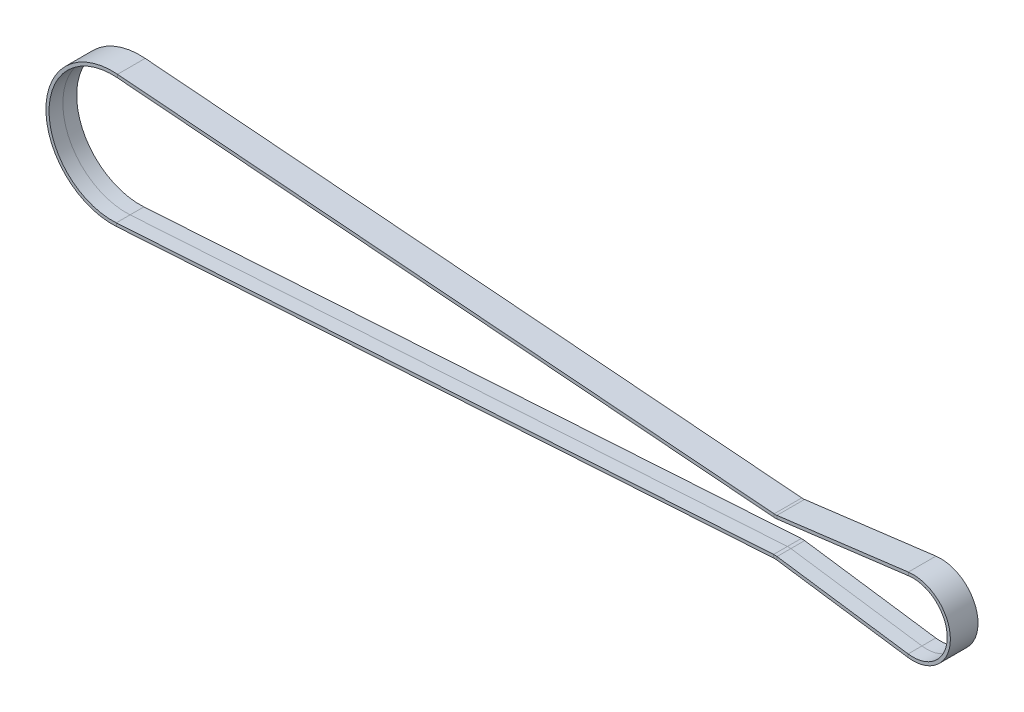
ISO-10303-21;
HEADER;
FILE_DESCRIPTION(('STEP AP214'),'2;1');
FILE_NAME('part.step','',(''),(''),'','','');
FILE_SCHEMA(('AUTOMOTIVE_DESIGN { 1 0 10303 214 1 1 1 1 }'));
ENDSEC;
DATA;
#1=APPLICATION_CONTEXT('core data for automotive mechanical design processes');
#2=APPLICATION_PROTOCOL_DEFINITION('international standard','automotive_design',2000,#1);
#3=PRODUCT_CONTEXT('',#1,'mechanical');
#4=PRODUCT('Part','Part','',(#3));
#5=PRODUCT_RELATED_PRODUCT_CATEGORY('part','',(#4));
#6=PRODUCT_DEFINITION_FORMATION('','',#4);
#7=PRODUCT_DEFINITION_CONTEXT('part definition',#1,'design');
#8=PRODUCT_DEFINITION('design','',#6,#7);
#9=PRODUCT_DEFINITION_SHAPE('','',#8);
#10=(LENGTH_UNIT() NAMED_UNIT(*) SI_UNIT(.MILLI.,.METRE.));
#11=(NAMED_UNIT(*) PLANE_ANGLE_UNIT() SI_UNIT($,.RADIAN.));
#12=(NAMED_UNIT(*) SI_UNIT($,.STERADIAN.) SOLID_ANGLE_UNIT());
#13=UNCERTAINTY_MEASURE_WITH_UNIT(LENGTH_MEASURE(1.E-05),#10,'distance_accuracy_value','');
#14=(GEOMETRIC_REPRESENTATION_CONTEXT(3) GLOBAL_UNCERTAINTY_ASSIGNED_CONTEXT((#13)) GLOBAL_UNIT_ASSIGNED_CONTEXT((#10,
#11,#12)) REPRESENTATION_CONTEXT('',''));
#15=CARTESIAN_POINT('',(0.,0.,0.));
#16=DIRECTION('',(0.,0.,1.));
#17=DIRECTION('',(1.,0.,0.));
#18=AXIS2_PLACEMENT_3D('',#15,#16,#17);
#19=CARTESIAN_POINT('',(-240.090138503193,-9.9164203972662,0.));
#20=DIRECTION('',(0.,0.,-1.));
#21=DIRECTION('',(-1.,0.,0.));
#22=AXIS2_PLACEMENT_3D('',#19,#20,#21);
#23=CYLINDRICAL_SURFACE('',#22,22.9);
#24=DIRECTION('',(0.,0.,1.));
#25=VECTOR('',#24,1.);
#26=CARTESIAN_POINT('',(-238.647292696642,-32.7709209601426,-5.));
#27=LINE('',#26,#25);
#28=CARTESIAN_POINT('',(-238.647292696642,-32.7709209601426,-5.));
#29=VERTEX_POINT('',#28);
#30=CARTESIAN_POINT('',(-238.647292696642,-32.7709209601426,0.));
#31=VERTEX_POINT('',#30);
#32=EDGE_CURVE('E242',#29,#31,#27,.T.);
#33=ORIENTED_EDGE('',*,*,#32,.F.);
#34=CARTESIAN_POINT('',(-240.090138503193,-9.9164203972662,-5.));
#35=DIRECTION('',(0.,0.,-1.));
#36=DIRECTION('',(0.063006367098305,-0.998013125016437,0.));
#37=AXIS2_PLACEMENT_3D('',#34,#35,#36);
#38=CIRCLE('',#37,22.9);
#39=CARTESIAN_POINT('',(-238.26979899704,12.9111148197111,-5.));
#40=VERTEX_POINT('',#39);
#41=EDGE_CURVE('E241',#29,#40,#38,.T.);
#42=ORIENTED_EDGE('',*,*,#41,.T.);
#43=DIRECTION('',(0.,0.,1.));
#44=VECTOR('',#43,1.);
#45=CARTESIAN_POINT('',(-238.26979899704,12.9111148197111,-5.));
#46=LINE('',#45,#44);
#47=CARTESIAN_POINT('',(-238.26979899704,12.9111148197111,0.));
#48=VERTEX_POINT('',#47);
#49=EDGE_CURVE('E216',#40,#48,#46,.T.);
#50=ORIENTED_EDGE('',*,*,#49,.T.);
#51=CARTESIAN_POINT('',(-240.090138503193,-9.9164203972662,0.));
#52=DIRECTION('',(0.,0.,-1.));
#53=DIRECTION('',(0.063006367098305,-0.998013125016437,0.));
#54=AXIS2_PLACEMENT_3D('',#51,#52,#53);
#55=CIRCLE('',#54,22.9);
#56=EDGE_CURVE('E246',#31,#48,#55,.T.);
#57=ORIENTED_EDGE('',*,*,#56,.F.);
#58=EDGE_LOOP('',(#33,#42,#50,#57));
#59=FACE_BOUND('',#58,.T.);
#60=ADVANCED_FACE('F32',(#59),#23,.F.);
#61=CARTESIAN_POINT('',(-238.26979899704,12.9111148197111,-5.));
#62=DIRECTION('',(0.0794908081289421,0.996835598994642,0.));
#63=DIRECTION('',(-0.996835598994642,0.0794908081289421,0.));
#64=AXIS2_PLACEMENT_3D('',#61,#62,#63);
#65=PLANE('',#64);
#66=DIRECTION('',(0.996835598994643,-0.0794908081289421,0.));
#67=VECTOR('',#66,1.);
#68=CARTESIAN_POINT('',(-238.26979899704,12.9111148197111,0.));
#69=LINE('',#68,#67);
#70=CARTESIAN_POINT('',(-0.482509205342596,-6.05079208589749,0.));
#71=VERTEX_POINT('',#70);
#72=EDGE_CURVE('E222',#48,#71,#69,.T.);
#73=ORIENTED_EDGE('',*,*,#72,.F.);
#74=ORIENTED_EDGE('',*,*,#49,.F.);
#75=DIRECTION('',(0.996835598994643,-0.0794908081289421,0.));
#76=VECTOR('',#75,1.);
#77=CARTESIAN_POINT('',(-238.26979899704,12.9111148197111,-5.));
#78=LINE('',#77,#76);
#79=CARTESIAN_POINT('',(-0.482509205342596,-6.05079208589749,-5.));
#80=VERTEX_POINT('',#79);
#81=EDGE_CURVE('E220',#40,#80,#78,.T.);
#82=ORIENTED_EDGE('',*,*,#81,.T.);
#83=DIRECTION('',(0.,0.,1.));
#84=VECTOR('',#83,1.);
#85=CARTESIAN_POINT('',(-0.482509205342624,-6.05079208589748,-5.));
#86=LINE('',#85,#84);
#87=EDGE_CURVE('E238',#80,#71,#86,.T.);
#88=ORIENTED_EDGE('',*,*,#87,.T.);
#89=EDGE_LOOP('',(#73,#74,#82,#88));
#90=FACE_BOUND('',#89,.T.);
#91=ADVANCED_FACE('F218',(#90),#65,.F.);
#92=CARTESIAN_POINT('',(-238.26979899704,12.9111148197111,0.));
#93=DIRECTION('',(0.0794908081289421,0.996835598994642,0.));
#94=DIRECTION('',(-0.996835598994642,0.0794908081289421,0.));
#95=AXIS2_PLACEMENT_3D('',#92,#93,#94);
#96=PLANE('',#95);
#97=DIRECTION('',(0.996835598994643,-0.0794908081289421,0.));
#98=VECTOR('',#97,1.);
#99=CARTESIAN_POINT('',(-238.26979899704,12.9111148197111,5.));
#100=LINE('',#99,#98);
#101=CARTESIAN_POINT('',(-238.26979899704,12.9111148197111,5.));
#102=VERTEX_POINT('',#101);
#103=CARTESIAN_POINT('',(-0.482509205342596,-6.05079208589749,5.));
#104=VERTEX_POINT('',#103);
#105=EDGE_CURVE('E357',#102,#104,#100,.T.);
#106=ORIENTED_EDGE('',*,*,#105,.F.);
#107=DIRECTION('',(0.,0.,1.));
#108=VECTOR('',#107,1.);
#109=CARTESIAN_POINT('',(-238.26979899704,12.9111148197111,0.));
#110=LINE('',#109,#108);
#111=EDGE_CURVE('E227',#48,#102,#110,.T.);
#112=ORIENTED_EDGE('',*,*,#111,.F.);
#113=ORIENTED_EDGE('',*,*,#72,.T.);
#114=DIRECTION('',(0.,0.,1.));
#115=VECTOR('',#114,1.);
#116=CARTESIAN_POINT('',(-0.482509205342624,-6.05079208589748,0.));
#117=LINE('',#116,#115);
#118=EDGE_CURVE('E431',#71,#104,#117,.T.);
#119=ORIENTED_EDGE('',*,*,#118,.T.);
#120=EDGE_LOOP('',(#106,#112,#113,#119));
#121=FACE_BOUND('',#120,.T.);
#122=ADVANCED_FACE('F503',(#121),#96,.F.);
#123=CARTESIAN_POINT('',(-238.26979899704,12.9111148197111,5.));
#124=DIRECTION('',(0.,0.,-1.));
#125=DIRECTION('',(-1.,0.,0.));
#126=AXIS2_PLACEMENT_3D('',#123,#124,#125);
#127=PLANE('',#126);
#128=DIRECTION('',(0.996835598994643,-0.0794908081289421,0.));
#129=VECTOR('',#128,1.);
#130=CARTESIAN_POINT('',(-238.179179475773,14.047507402565,5.));
#131=LINE('',#130,#129);
#132=CARTESIAN_POINT('',(-238.179179475773,14.047507402565,5.));
#133=VERTEX_POINT('',#132);
#134=CARTESIAN_POINT('',(-0.391889684075608,-4.91439950304359,5.));
#135=VERTEX_POINT('',#134);
#136=EDGE_CURVE('E299',#133,#135,#131,.T.);
#137=ORIENTED_EDGE('',*,*,#136,.F.);
#138=DIRECTION('',(0.0794908081289369,0.996835598994643,0.));
#139=VECTOR('',#138,1.);
#140=CARTESIAN_POINT('',(-238.26979899704,12.9111148197111,5.));
#141=LINE('',#140,#139);
#142=EDGE_CURVE('E252',#102,#133,#141,.T.);
#143=ORIENTED_EDGE('',*,*,#142,.F.);
#144=ORIENTED_EDGE('',*,*,#105,.T.);
#145=DIRECTION('',(0.0794908081289369,0.996835598994643,0.));
#146=VECTOR('',#145,1.);
#147=CARTESIAN_POINT('',(-0.482509205342624,-6.05079208589748,5.));
#148=LINE('',#147,#146);
#149=EDGE_CURVE('E355',#104,#135,#148,.T.);
#150=ORIENTED_EDGE('',*,*,#149,.T.);
#151=EDGE_LOOP('',(#137,#143,#144,#150));
#152=FACE_BOUND('',#151,.T.);
#153=ADVANCED_FACE('F510',(#152),#127,.F.);
#154=CARTESIAN_POINT('',(-238.179179475773,14.047507402565,5.));
#155=DIRECTION('',(-0.0794908081289421,-0.996835598994642,0.));
#156=DIRECTION('',(0.996835598994642,-0.0794908081289421,0.));
#157=AXIS2_PLACEMENT_3D('',#154,#155,#156);
#158=PLANE('',#157);
#159=DIRECTION('',(0.996835598994643,-0.0794908081289421,0.));
#160=VECTOR('',#159,1.);
#161=CARTESIAN_POINT('',(-238.179179475773,14.047507402565,-5.));
#162=LINE('',#161,#160);
#163=CARTESIAN_POINT('',(-238.179179475773,14.047507402565,-5.));
#164=VERTEX_POINT('',#163);
#165=CARTESIAN_POINT('',(-0.391889684075608,-4.91439950304359,-5.));
#166=VERTEX_POINT('',#165);
#167=EDGE_CURVE('E258',#164,#166,#162,.T.);
#168=ORIENTED_EDGE('',*,*,#167,.F.);
#169=DIRECTION('',(0.,0.,-1.));
#170=VECTOR('',#169,1.);
#171=CARTESIAN_POINT('',(-238.179179475773,14.047507402565,5.));
#172=LINE('',#171,#170);
#173=EDGE_CURVE('E249',#133,#164,#172,.T.);
#174=ORIENTED_EDGE('',*,*,#173,.F.);
#175=ORIENTED_EDGE('',*,*,#136,.T.);
#176=DIRECTION('',(0.,0.,-1.));
#177=VECTOR('',#176,1.);
#178=CARTESIAN_POINT('',(-0.391889684075636,-4.91439950304359,5.));
#179=LINE('',#178,#177);
#180=EDGE_CURVE('E302',#135,#166,#179,.T.);
#181=ORIENTED_EDGE('',*,*,#180,.T.);
#182=EDGE_LOOP('',(#168,#174,#175,#181));
#183=FACE_BOUND('',#182,.T.);
#184=ADVANCED_FACE('F297',(#183),#158,.F.);
#185=CARTESIAN_POINT('',(-238.179179475773,14.047507402565,-5.));
#186=DIRECTION('',(0.,0.,1.));
#187=DIRECTION('',(1.,0.,0.));
#188=AXIS2_PLACEMENT_3D('',#185,#186,#187);
#189=PLANE('',#188);
#190=DIRECTION('',(-0.0794908081289369,-0.996835598994643,0.));
#191=VECTOR('',#190,1.);
#192=CARTESIAN_POINT('',(-0.391889684075636,-4.91439950304359,-5.));
#193=LINE('',#192,#191);
#194=EDGE_CURVE('E236',#166,#80,#193,.T.);
#195=ORIENTED_EDGE('',*,*,#194,.T.);
#196=ORIENTED_EDGE('',*,*,#81,.F.);
#197=DIRECTION('',(-0.0794908081289369,-0.996835598994643,0.));
#198=VECTOR('',#197,1.);
#199=CARTESIAN_POINT('',(-238.179179475773,14.047507402565,-5.));
#200=LINE('',#199,#198);
#201=EDGE_CURVE('E234',#164,#40,#200,.T.);
#202=ORIENTED_EDGE('',*,*,#201,.F.);
#203=ORIENTED_EDGE('',*,*,#167,.T.);
#204=EDGE_LOOP('',(#195,#196,#202,#203));
#205=FACE_BOUND('',#204,.T.);
#206=ADVANCED_FACE('F232',(#205),#189,.F.);
#207=CARTESIAN_POINT('',(0.,0.,0.));
#208=DIRECTION('',(0.,0.,1.));
#209=DIRECTION('',(1.,0.,0.));
#210=AXIS2_PLACEMENT_3D('',#207,#208,#209);
#211=CYLINDRICAL_SURFACE('',#210,6.07000000000013);
#212=CARTESIAN_POINT('',(0.,0.,0.));
#213=DIRECTION('',(0.,0.,1.));
#214=DIRECTION('',(-0.0794908081289428,-0.996835598994642,0.));
#215=AXIS2_PLACEMENT_3D('',#212,#213,#214);
#216=CIRCLE('',#215,6.07000000000013);
#217=CARTESIAN_POINT('',(0.760799283202512,-6.02213288218387,0.));
#218=VERTEX_POINT('',#217);
#219=EDGE_CURVE('E438',#71,#218,#216,.T.);
#220=ORIENTED_EDGE('',*,*,#219,.F.);
#221=ORIENTED_EDGE('',*,*,#87,.F.);
#222=CARTESIAN_POINT('',(0.,0.,-5.));
#223=DIRECTION('',(0.,0.,1.));
#224=DIRECTION('',(-0.0794908081289428,-0.996835598994642,0.));
#225=AXIS2_PLACEMENT_3D('',#222,#223,#224);
#226=CIRCLE('',#225,6.07000000000013);
#227=CARTESIAN_POINT('',(0.760799283202512,-6.02213288218387,-5.));
#228=VERTEX_POINT('',#227);
#229=EDGE_CURVE('E257',#80,#228,#226,.T.);
#230=ORIENTED_EDGE('',*,*,#229,.T.);
#231=DIRECTION('',(0.,0.,1.));
#232=VECTOR('',#231,1.);
#233=CARTESIAN_POINT('',(0.760799283202496,-6.02213288218373,-5.));
#234=LINE('',#233,#232);
#235=EDGE_CURVE('E450',#228,#218,#234,.T.);
#236=ORIENTED_EDGE('',*,*,#235,.T.);
#237=EDGE_LOOP('',(#220,#221,#230,#236));
#238=FACE_BOUND('',#237,.T.);
#239=ADVANCED_FACE('F453',(#238),#211,.T.);
#240=CARTESIAN_POINT('',(0.,0.,0.));
#241=DIRECTION('',(0.,0.,1.));
#242=DIRECTION('',(1.,0.,0.));
#243=AXIS2_PLACEMENT_3D('',#240,#241,#242);
#244=CYLINDRICAL_SURFACE('',#243,6.07000000000013);
#245=CARTESIAN_POINT('',(0.,0.,5.));
#246=DIRECTION('',(0.,0.,1.));
#247=DIRECTION('',(-0.0794908081289428,-0.996835598994642,0.));
#248=AXIS2_PLACEMENT_3D('',#245,#246,#247);
#249=CIRCLE('',#248,6.07000000000013);
#250=CARTESIAN_POINT('',(0.760799283202512,-6.02213288218387,5.));
#251=VERTEX_POINT('',#250);
#252=EDGE_CURVE('E362',#104,#251,#249,.T.);
#253=ORIENTED_EDGE('',*,*,#252,.F.);
#254=ORIENTED_EDGE('',*,*,#118,.F.);
#255=ORIENTED_EDGE('',*,*,#219,.T.);
#256=DIRECTION('',(0.,0.,1.));
#257=VECTOR('',#256,1.);
#258=CARTESIAN_POINT('',(0.760799283202496,-6.02213288218373,0.));
#259=LINE('',#258,#257);
#260=EDGE_CURVE('E435',#218,#251,#259,.T.);
#261=ORIENTED_EDGE('',*,*,#260,.T.);
#262=EDGE_LOOP('',(#253,#254,#255,#261));
#263=FACE_BOUND('',#262,.T.);
#264=ADVANCED_FACE('F446',(#263),#244,.T.);
#265=CARTESIAN_POINT('',(-0.482509205342679,-6.05079208589761,5.));
#266=DIRECTION('',(0.,0.,-1.));
#267=DIRECTION('',(-1.,0.,0.));
#268=AXIS2_PLACEMENT_3D('',#265,#266,#267);
#269=PLANE('',#268);
#270=CARTESIAN_POINT('',(0.,0.,5.));
#271=DIRECTION('',(0.,0.,1.));
#272=DIRECTION('',(-0.0794908081289442,-0.996835598994642,0.));
#273=AXIS2_PLACEMENT_3D('',#270,#271,#272);
#274=CIRCLE('',#273,4.93000000000013);
#275=CARTESIAN_POINT('',(0.617914409586239,-4.89112275274574,5.));
#276=VERTEX_POINT('',#275);
#277=EDGE_CURVE('E310',#135,#276,#274,.T.);
#278=ORIENTED_EDGE('',*,*,#277,.F.);
#279=ORIENTED_EDGE('',*,*,#149,.F.);
#280=ORIENTED_EDGE('',*,*,#252,.T.);
#281=DIRECTION('',(-0.125337608435334,0.99211414862994,0.));
#282=VECTOR('',#281,1.);
#283=CARTESIAN_POINT('',(0.760799283202496,-6.02213288218373,5.));
#284=LINE('',#283,#282);
#285=EDGE_CURVE('E359',#251,#276,#284,.T.);
#286=ORIENTED_EDGE('',*,*,#285,.T.);
#287=EDGE_LOOP('',(#278,#279,#280,#286));
#288=FACE_BOUND('',#287,.T.);
#289=ADVANCED_FACE('F443',(#288),#269,.F.);
#290=CARTESIAN_POINT('',(0.,0.,0.));
#291=DIRECTION('',(0.,0.,1.));
#292=DIRECTION('',(1.,0.,0.));
#293=AXIS2_PLACEMENT_3D('',#290,#291,#292);
#294=CYLINDRICAL_SURFACE('',#293,4.93000000000013);
#295=CARTESIAN_POINT('',(0.,0.,-5.));
#296=DIRECTION('',(0.,0.,1.));
#297=DIRECTION('',(-0.0794908081289442,-0.996835598994642,0.));
#298=AXIS2_PLACEMENT_3D('',#295,#296,#297);
#299=CIRCLE('',#298,4.93000000000013);
#300=CARTESIAN_POINT('',(0.617914409586239,-4.89112275274574,-5.));
#301=VERTEX_POINT('',#300);
#302=EDGE_CURVE('E263',#166,#301,#299,.T.);
#303=ORIENTED_EDGE('',*,*,#302,.F.);
#304=ORIENTED_EDGE('',*,*,#180,.F.);
#305=ORIENTED_EDGE('',*,*,#277,.T.);
#306=DIRECTION('',(0.,0.,-1.));
#307=VECTOR('',#306,1.);
#308=CARTESIAN_POINT('',(0.617914409586223,-4.89112275274561,5.));
#309=LINE('',#308,#307);
#310=EDGE_CURVE('E307',#276,#301,#309,.T.);
#311=ORIENTED_EDGE('',*,*,#310,.T.);
#312=EDGE_LOOP('',(#303,#304,#305,#311));
#313=FACE_BOUND('',#312,.T.);
#314=ADVANCED_FACE('F571',(#313),#294,.F.);
#315=CARTESIAN_POINT('',(-0.391889684075691,-4.91439950304372,-5.));
#316=DIRECTION('',(0.,0.,1.));
#317=DIRECTION('',(1.,0.,0.));
#318=AXIS2_PLACEMENT_3D('',#315,#316,#317);
#319=PLANE('',#318);
#320=DIRECTION('',(0.125337608435334,-0.99211414862994,0.));
#321=VECTOR('',#320,1.);
#322=CARTESIAN_POINT('',(0.617914409586223,-4.89112275274561,-5.));
#323=LINE('',#322,#321);
#324=EDGE_CURVE('E259',#301,#228,#323,.T.);
#325=ORIENTED_EDGE('',*,*,#324,.T.);
#326=ORIENTED_EDGE('',*,*,#229,.F.);
#327=ORIENTED_EDGE('',*,*,#194,.F.);
#328=ORIENTED_EDGE('',*,*,#302,.T.);
#329=EDGE_LOOP('',(#325,#326,#327,#328));
#330=FACE_BOUND('',#329,.T.);
#331=ADVANCED_FACE('F569',(#330),#319,.F.);
#332=CARTESIAN_POINT('',(0.760799283202496,-6.02213288218374,-5.));
#333=DIRECTION('',(-0.125337608435329,0.992114148629941,0.));
#334=DIRECTION('',(-0.992114148629941,-0.125337608435329,0.));
#335=AXIS2_PLACEMENT_3D('',#332,#333,#334);
#336=PLANE('',#335);
#337=DIRECTION('',(0.992114148629941,0.125337608435329,0.));
#338=VECTOR('',#337,1.);
#339=CARTESIAN_POINT('',(0.760799283202496,-6.02213288218374,0.));
#340=LINE('',#339,#338);
#341=CARTESIAN_POINT('',(48.3457742612661,-0.0105393881873993,0.));
#342=VERTEX_POINT('',#341);
#343=EDGE_CURVE('E404',#218,#342,#340,.T.);
#344=ORIENTED_EDGE('',*,*,#343,.F.);
#345=ORIENTED_EDGE('',*,*,#235,.F.);
#346=DIRECTION('',(0.992114148629941,0.125337608435329,0.));
#347=VECTOR('',#346,1.);
#348=CARTESIAN_POINT('',(0.760799283202496,-6.02213288218374,-5.));
#349=LINE('',#348,#347);
#350=CARTESIAN_POINT('',(48.3457742612661,-0.0105393881873993,-5.));
#351=VERTEX_POINT('',#350);
#352=EDGE_CURVE('E262',#228,#351,#349,.T.);
#353=ORIENTED_EDGE('',*,*,#352,.T.);
#354=DIRECTION('',(0.,0.,1.));
#355=VECTOR('',#354,1.);
#356=CARTESIAN_POINT('',(48.3457742612661,-0.0105393881873958,-5.));
#357=LINE('',#356,#355);
#358=EDGE_CURVE('E458',#351,#342,#357,.T.);
#359=ORIENTED_EDGE('',*,*,#358,.T.);
#360=EDGE_LOOP('',(#344,#345,#353,#359));
#361=FACE_BOUND('',#360,.T.);
#362=ADVANCED_FACE('F456',(#361),#336,.F.);
#363=CARTESIAN_POINT('',(0.760799283202496,-6.02213288218374,0.));
#364=DIRECTION('',(-0.125337608435329,0.992114148629941,0.));
#365=DIRECTION('',(-0.992114148629941,-0.125337608435329,0.));
#366=AXIS2_PLACEMENT_3D('',#363,#364,#365);
#367=PLANE('',#366);
#368=DIRECTION('',(0.992114148629941,0.125337608435329,0.));
#369=VECTOR('',#368,1.);
#370=CARTESIAN_POINT('',(0.760799283202496,-6.02213288218374,5.));
#371=LINE('',#370,#369);
#372=CARTESIAN_POINT('',(48.3457742612661,-0.0105393881873993,5.));
#373=VERTEX_POINT('',#372);
#374=EDGE_CURVE('E367',#251,#373,#371,.T.);
#375=ORIENTED_EDGE('',*,*,#374,.F.);
#376=ORIENTED_EDGE('',*,*,#260,.F.);
#377=ORIENTED_EDGE('',*,*,#343,.T.);
#378=DIRECTION('',(0.,0.,1.));
#379=VECTOR('',#378,1.);
#380=CARTESIAN_POINT('',(48.3457742612661,-0.0105393881873958,0.));
#381=LINE('',#380,#379);
#382=EDGE_CURVE('E400',#342,#373,#381,.T.);
#383=ORIENTED_EDGE('',*,*,#382,.T.);
#384=EDGE_LOOP('',(#375,#376,#377,#383));
#385=FACE_BOUND('',#384,.T.);
#386=ADVANCED_FACE('F402',(#385),#367,.F.);
#387=CARTESIAN_POINT('',(0.760799283202496,-6.02213288218374,5.));
#388=DIRECTION('',(0.,0.,-1.));
#389=DIRECTION('',(-1.,0.,0.));
#390=AXIS2_PLACEMENT_3D('',#387,#388,#389);
#391=PLANE('',#390);
#392=DIRECTION('',(0.992114148629941,0.125337608435329,0.));
#393=VECTOR('',#392,1.);
#394=CARTESIAN_POINT('',(0.617914409586223,-4.89112275274562,5.));
#395=LINE('',#394,#393);
#396=CARTESIAN_POINT('',(48.2028893876498,1.12047074125072,5.));
#397=VERTEX_POINT('',#396);
#398=EDGE_CURVE('E315',#276,#397,#395,.T.);
#399=ORIENTED_EDGE('',*,*,#398,.F.);
#400=ORIENTED_EDGE('',*,*,#285,.F.);
#401=ORIENTED_EDGE('',*,*,#374,.T.);
#402=DIRECTION('',(-0.125337608435334,0.99211414862994,0.));
#403=VECTOR('',#402,1.);
#404=CARTESIAN_POINT('',(48.3457742612661,-0.0105393881873958,5.));
#405=LINE('',#404,#403);
#406=EDGE_CURVE('E364',#373,#397,#405,.T.);
#407=ORIENTED_EDGE('',*,*,#406,.T.);
#408=EDGE_LOOP('',(#399,#400,#401,#407));
#409=FACE_BOUND('',#408,.T.);
#410=ADVANCED_FACE('F395',(#409),#391,.F.);
#411=CARTESIAN_POINT('',(0.617914409586223,-4.89112275274562,5.));
#412=DIRECTION('',(0.125337608435329,-0.992114148629941,0.));
#413=DIRECTION('',(0.992114148629941,0.125337608435329,0.));
#414=AXIS2_PLACEMENT_3D('',#411,#412,#413);
#415=PLANE('',#414);
#416=DIRECTION('',(0.992114148629941,0.125337608435329,0.));
#417=VECTOR('',#416,1.);
#418=CARTESIAN_POINT('',(0.617914409586223,-4.89112275274562,-5.));
#419=LINE('',#418,#417);
#420=CARTESIAN_POINT('',(48.2028893876498,1.12047074125072,-5.));
#421=VERTEX_POINT('',#420);
#422=EDGE_CURVE('E268',#301,#421,#419,.T.);
#423=ORIENTED_EDGE('',*,*,#422,.F.);
#424=ORIENTED_EDGE('',*,*,#310,.F.);
#425=ORIENTED_EDGE('',*,*,#398,.T.);
#426=DIRECTION('',(0.,0.,-1.));
#427=VECTOR('',#426,1.);
#428=CARTESIAN_POINT('',(48.2028893876498,1.12047074125073,5.));
#429=LINE('',#428,#427);
#430=EDGE_CURVE('E312',#397,#421,#429,.T.);
#431=ORIENTED_EDGE('',*,*,#430,.T.);
#432=EDGE_LOOP('',(#423,#424,#425,#431));
#433=FACE_BOUND('',#432,.T.);
#434=ADVANCED_FACE('F391',(#433),#415,.F.);
#435=CARTESIAN_POINT('',(0.617914409586223,-4.89112275274562,-5.));
#436=DIRECTION('',(0.,0.,1.));
#437=DIRECTION('',(1.,0.,0.));
#438=AXIS2_PLACEMENT_3D('',#435,#436,#437);
#439=PLANE('',#438);
#440=DIRECTION('',(0.125337608435334,-0.99211414862994,0.));
#441=VECTOR('',#440,1.);
#442=CARTESIAN_POINT('',(48.2028893876498,1.12047074125073,-5.));
#443=LINE('',#442,#441);
#444=EDGE_CURVE('E264',#421,#351,#443,.T.);
#445=ORIENTED_EDGE('',*,*,#444,.T.);
#446=ORIENTED_EDGE('',*,*,#352,.F.);
#447=ORIENTED_EDGE('',*,*,#324,.F.);
#448=ORIENTED_EDGE('',*,*,#422,.T.);
#449=EDGE_LOOP('',(#445,#446,#447,#448));
#450=FACE_BOUND('',#449,.T.);
#451=ADVANCED_FACE('F386',(#450),#439,.F.);
#452=CARTESIAN_POINT('',(49.8999606058641,-12.3127548311987,0.));
#453=DIRECTION('',(0.,0.,-1.));
#454=DIRECTION('',(-1.,0.,0.));
#455=AXIS2_PLACEMENT_3D('',#452,#453,#454);
#456=CYLINDRICAL_SURFACE('',#455,12.4);
#457=CARTESIAN_POINT('',(49.8999606058641,-12.3127548311987,0.));
#458=DIRECTION('',(0.,0.,-1.));
#459=DIRECTION('',(-0.125337608435331,0.992114148629941,0.));
#460=AXIS2_PLACEMENT_3D('',#457,#458,#459);
#461=CIRCLE('',#460,12.4);
#462=CARTESIAN_POINT('',(48.1426815657474,-24.5876059657406,0.));
#463=VERTEX_POINT('',#462);
#464=EDGE_CURVE('E193',#342,#463,#461,.T.);
#465=ORIENTED_EDGE('',*,*,#464,.F.);
#466=ORIENTED_EDGE('',*,*,#358,.F.);
#467=CARTESIAN_POINT('',(49.8999606058641,-12.3127548311987,-5.));
#468=DIRECTION('',(0.,0.,-1.));
#469=DIRECTION('',(-0.125337608435331,0.992114148629941,0.));
#470=AXIS2_PLACEMENT_3D('',#467,#468,#469);
#471=CIRCLE('',#470,12.4);
#472=CARTESIAN_POINT('',(48.1426815657474,-24.5876059657406,-5.));
#473=VERTEX_POINT('',#472);
#474=EDGE_CURVE('E267',#351,#473,#471,.T.);
#475=ORIENTED_EDGE('',*,*,#474,.T.);
#476=DIRECTION('',(0.,0.,1.));
#477=VECTOR('',#476,1.);
#478=CARTESIAN_POINT('',(48.1426815657474,-24.5876059657406,-5.));
#479=LINE('',#478,#477);
#480=EDGE_CURVE('E464',#473,#463,#479,.T.);
#481=ORIENTED_EDGE('',*,*,#480,.T.);
#482=EDGE_LOOP('',(#465,#466,#475,#481));
#483=FACE_BOUND('',#482,.T.);
#484=ADVANCED_FACE('F516',(#483),#456,.F.);
#485=CARTESIAN_POINT('',(49.8999606058641,-12.3127548311987,0.));
#486=DIRECTION('',(0.,0.,-1.));
#487=DIRECTION('',(-1.,0.,0.));
#488=AXIS2_PLACEMENT_3D('',#485,#486,#487);
#489=CYLINDRICAL_SURFACE('',#488,12.4);
#490=CARTESIAN_POINT('',(49.8999606058641,-12.3127548311987,5.));
#491=DIRECTION('',(0.,0.,-1.));
#492=DIRECTION('',(-0.125337608435331,0.992114148629941,0.));
#493=AXIS2_PLACEMENT_3D('',#490,#491,#492);
#494=CIRCLE('',#493,12.4);
#495=CARTESIAN_POINT('',(48.1426815657474,-24.5876059657406,5.));
#496=VERTEX_POINT('',#495);
#497=EDGE_CURVE('E187',#373,#496,#494,.T.);
#498=ORIENTED_EDGE('',*,*,#497,.F.);
#499=ORIENTED_EDGE('',*,*,#382,.F.);
#500=ORIENTED_EDGE('',*,*,#464,.T.);
#501=DIRECTION('',(0.,0.,1.));
#502=VECTOR('',#501,1.);
#503=CARTESIAN_POINT('',(48.1426815657474,-24.5876059657406,0.));
#504=LINE('',#503,#502);
#505=EDGE_CURVE('E408',#463,#496,#504,.T.);
#506=ORIENTED_EDGE('',*,*,#505,.T.);
#507=EDGE_LOOP('',(#498,#499,#500,#506));
#508=FACE_BOUND('',#507,.T.);
#509=ADVANCED_FACE('F407',(#508),#489,.F.);
#510=CARTESIAN_POINT('',(48.345774261266,-0.0105393881873958,5.));
#511=DIRECTION('',(0.,0.,-1.));
#512=DIRECTION('',(-1.,0.,0.));
#513=AXIS2_PLACEMENT_3D('',#510,#511,#512);
#514=PLANE('',#513);
#515=CARTESIAN_POINT('',(49.8999606058641,-12.3127548311987,5.));
#516=DIRECTION('',(0.,0.,-1.));
#517=DIRECTION('',(-0.125337608435328,0.992114148629941,0.));
#518=AXIS2_PLACEMENT_3D('',#515,#516,#517);
#519=CIRCLE('',#518,13.54);
#520=CARTESIAN_POINT('',(47.9811252668979,-25.7161003442388,5.));
#521=VERTEX_POINT('',#520);
#522=EDGE_CURVE('E320',#397,#521,#519,.T.);
#523=ORIENTED_EDGE('',*,*,#522,.F.);
#524=ORIENTED_EDGE('',*,*,#406,.F.);
#525=ORIENTED_EDGE('',*,*,#497,.T.);
#526=DIRECTION('',(-0.141716051622315,-0.989907349559837,0.));
#527=VECTOR('',#526,1.);
#528=CARTESIAN_POINT('',(48.1426815657474,-24.5876059657406,5.));
#529=LINE('',#528,#527);
#530=EDGE_CURVE('E369',#496,#521,#529,.T.);
#531=ORIENTED_EDGE('',*,*,#530,.T.);
#532=EDGE_LOOP('',(#523,#524,#525,#531));
#533=FACE_BOUND('',#532,.T.);
#534=ADVANCED_FACE('F375',(#533),#514,.F.);
#535=CARTESIAN_POINT('',(49.8999606058641,-12.3127548311987,0.));
#536=DIRECTION('',(0.,0.,-1.));
#537=DIRECTION('',(-1.,0.,0.));
#538=AXIS2_PLACEMENT_3D('',#535,#536,#537);
#539=CYLINDRICAL_SURFACE('',#538,13.54);
#540=CARTESIAN_POINT('',(49.8999606058641,-12.3127548311987,-5.));
#541=DIRECTION('',(0.,0.,-1.));
#542=DIRECTION('',(-0.125337608435328,0.992114148629941,0.));
#543=AXIS2_PLACEMENT_3D('',#540,#541,#542);
#544=CIRCLE('',#543,13.54);
#545=CARTESIAN_POINT('',(47.9811252668979,-25.7161003442388,-5.));
#546=VERTEX_POINT('',#545);
#547=EDGE_CURVE('E273',#421,#546,#544,.T.);
#548=ORIENTED_EDGE('',*,*,#547,.F.);
#549=ORIENTED_EDGE('',*,*,#430,.F.);
#550=ORIENTED_EDGE('',*,*,#522,.T.);
#551=DIRECTION('',(0.,0.,-1.));
#552=VECTOR('',#551,1.);
#553=CARTESIAN_POINT('',(47.9811252668979,-25.7161003442388,5.));
#554=LINE('',#553,#552);
#555=EDGE_CURVE('E317',#521,#546,#554,.T.);
#556=ORIENTED_EDGE('',*,*,#555,.T.);
#557=EDGE_LOOP('',(#548,#549,#550,#556));
#558=FACE_BOUND('',#557,.T.);
#559=ADVANCED_FACE('F374',(#558),#539,.T.);
#560=CARTESIAN_POINT('',(48.2028893876498,1.12047074125073,-5.));
#561=DIRECTION('',(0.,0.,1.));
#562=DIRECTION('',(1.,0.,0.));
#563=AXIS2_PLACEMENT_3D('',#560,#561,#562);
#564=PLANE('',#563);
#565=DIRECTION('',(0.141716051622315,0.989907349559837,0.));
#566=VECTOR('',#565,1.);
#567=CARTESIAN_POINT('',(47.9811252668979,-25.7161003442388,-5.));
#568=LINE('',#567,#566);
#569=EDGE_CURVE('E269',#546,#473,#568,.T.);
#570=ORIENTED_EDGE('',*,*,#569,.T.);
#571=ORIENTED_EDGE('',*,*,#474,.F.);
#572=ORIENTED_EDGE('',*,*,#444,.F.);
#573=ORIENTED_EDGE('',*,*,#547,.T.);
#574=EDGE_LOOP('',(#570,#571,#572,#573));
#575=FACE_BOUND('',#574,.T.);
#576=ADVANCED_FACE('F382',(#575),#564,.F.);
#577=CARTESIAN_POINT('',(48.1426815657474,-24.5876059657406,-5.));
#578=DIRECTION('',(-0.14171605162232,-0.989907349559836,0.));
#579=DIRECTION('',(0.989907349559836,-0.14171605162232,0.));
#580=AXIS2_PLACEMENT_3D('',#577,#578,#579);
#581=PLANE('',#580);
#582=DIRECTION('',(-0.989907349559836,0.14171605162232,0.));
#583=VECTOR('',#582,1.);
#584=CARTESIAN_POINT('',(48.1426815657474,-24.5876059657406,0.));
#585=LINE('',#584,#583);
#586=CARTESIAN_POINT('',(0.663551745398186,-17.7904498322951,0.));
#587=VERTEX_POINT('',#586);
#588=EDGE_CURVE('E160',#463,#587,#585,.T.);
#589=ORIENTED_EDGE('',*,*,#588,.F.);
#590=ORIENTED_EDGE('',*,*,#480,.F.);
#591=DIRECTION('',(-0.989907349559836,0.14171605162232,0.));
#592=VECTOR('',#591,1.);
#593=CARTESIAN_POINT('',(48.1426815657474,-24.5876059657406,-5.));
#594=LINE('',#593,#592);
#595=CARTESIAN_POINT('',(0.663551745398186,-17.7904498322951,-5.));
#596=VERTEX_POINT('',#595);
#597=EDGE_CURVE('E272',#473,#596,#594,.T.);
#598=ORIENTED_EDGE('',*,*,#597,.T.);
#599=DIRECTION('',(0.,0.,1.));
#600=VECTOR('',#599,1.);
#601=CARTESIAN_POINT('',(0.6635517453982,-17.7904498322951,-5.));
#602=LINE('',#601,#600);
#603=EDGE_CURVE('E324',#596,#587,#602,.T.);
#604=ORIENTED_EDGE('',*,*,#603,.T.);
#605=EDGE_LOOP('',(#589,#590,#598,#604));
#606=FACE_BOUND('',#605,.T.);
#607=ADVANCED_FACE('F487',(#606),#581,.F.);
#608=CARTESIAN_POINT('',(48.1426815657474,-24.5876059657406,0.));
#609=DIRECTION('',(-0.14171605162232,-0.989907349559836,0.));
#610=DIRECTION('',(0.989907349559836,-0.14171605162232,0.));
#611=AXIS2_PLACEMENT_3D('',#608,#609,#610);
#612=PLANE('',#611);
#613=DIRECTION('',(-0.989907349559836,0.14171605162232,0.));
#614=VECTOR('',#613,1.);
#615=CARTESIAN_POINT('',(48.1426815657474,-24.5876059657406,5.));
#616=LINE('',#615,#614);
#617=CARTESIAN_POINT('',(0.663551745398186,-17.7904498322951,5.));
#618=VERTEX_POINT('',#617);
#619=EDGE_CURVE('E153',#496,#618,#616,.T.);
#620=ORIENTED_EDGE('',*,*,#619,.F.);
#621=ORIENTED_EDGE('',*,*,#505,.F.);
#622=ORIENTED_EDGE('',*,*,#588,.T.);
#623=DIRECTION('',(0.,0.,1.));
#624=VECTOR('',#623,1.);
#625=CARTESIAN_POINT('',(0.6635517453982,-17.7904498322951,0.));
#626=LINE('',#625,#624);
#627=EDGE_CURVE('E328',#587,#618,#626,.T.);
#628=ORIENTED_EDGE('',*,*,#627,.T.);
#629=EDGE_LOOP('',(#620,#621,#622,#628));
#630=FACE_BOUND('',#629,.T.);
#631=ADVANCED_FACE('F485',(#630),#612,.F.);
#632=CARTESIAN_POINT('',(48.1426815657474,-24.5876059657406,5.));
#633=DIRECTION('',(0.,0.,-1.));
#634=DIRECTION('',(-1.,0.,0.));
#635=AXIS2_PLACEMENT_3D('',#632,#633,#634);
#636=PLANE('',#635);
#637=DIRECTION('',(-0.989907349559836,0.14171605162232,0.));
#638=VECTOR('',#637,1.);
#639=CARTESIAN_POINT('',(47.9811252668979,-25.7161003442388,5.));
#640=LINE('',#639,#638);
#641=CARTESIAN_POINT('',(0.501995446548734,-18.9189442107933,5.));
#642=VERTEX_POINT('',#641);
#643=EDGE_CURVE('E146',#521,#642,#640,.T.);
#644=ORIENTED_EDGE('',*,*,#643,.F.);
#645=ORIENTED_EDGE('',*,*,#530,.F.);
#646=ORIENTED_EDGE('',*,*,#619,.T.);
#647=DIRECTION('',(-0.141716051622315,-0.989907349559837,0.));
#648=VECTOR('',#647,1.);
#649=CARTESIAN_POINT('',(0.6635517453982,-17.7904498322951,5.));
#650=LINE('',#649,#648);
#651=EDGE_CURVE('E322',#618,#642,#650,.T.);
#652=ORIENTED_EDGE('',*,*,#651,.T.);
#653=EDGE_LOOP('',(#644,#645,#646,#652));
#654=FACE_BOUND('',#653,.T.);
#655=ADVANCED_FACE('F376',(#654),#636,.F.);
#656=CARTESIAN_POINT('',(47.9811252668979,-25.7161003442388,5.));
#657=DIRECTION('',(0.14171605162232,0.989907349559836,0.));
#658=DIRECTION('',(-0.989907349559836,0.14171605162232,0.));
#659=AXIS2_PLACEMENT_3D('',#656,#657,#658);
#660=PLANE('',#659);
#661=DIRECTION('',(-0.989907349559836,0.14171605162232,0.));
#662=VECTOR('',#661,1.);
#663=CARTESIAN_POINT('',(47.9811252668979,-25.7161003442388,-5.));
#664=LINE('',#663,#662);
#665=CARTESIAN_POINT('',(0.501995446548734,-18.9189442107933,-5.));
#666=VERTEX_POINT('',#665);
#667=EDGE_CURVE('E323',#546,#666,#664,.T.);
#668=ORIENTED_EDGE('',*,*,#667,.F.);
#669=ORIENTED_EDGE('',*,*,#555,.F.);
#670=ORIENTED_EDGE('',*,*,#643,.T.);
#671=DIRECTION('',(0.,0.,-1.));
#672=VECTOR('',#671,1.);
#673=CARTESIAN_POINT('',(0.501995446548748,-18.9189442107933,5.));
#674=LINE('',#673,#672);
#675=EDGE_CURVE('E277',#642,#666,#674,.T.);
#676=ORIENTED_EDGE('',*,*,#675,.T.);
#677=EDGE_LOOP('',(#668,#669,#670,#676));
#678=FACE_BOUND('',#677,.T.);
#679=ADVANCED_FACE('F377',(#678),#660,.F.);
#680=CARTESIAN_POINT('',(47.9811252668979,-25.7161003442388,-5.));
#681=DIRECTION('',(0.,0.,1.));
#682=DIRECTION('',(1.,0.,0.));
#683=AXIS2_PLACEMENT_3D('',#680,#681,#682);
#684=PLANE('',#683);
#685=DIRECTION('',(0.141716051622315,0.989907349559837,0.));
#686=VECTOR('',#685,1.);
#687=CARTESIAN_POINT('',(0.501995446548748,-18.9189442107933,-5.));
#688=LINE('',#687,#686);
#689=EDGE_CURVE('E274',#666,#596,#688,.T.);
#690=ORIENTED_EDGE('',*,*,#689,.T.);
#691=ORIENTED_EDGE('',*,*,#597,.F.);
#692=ORIENTED_EDGE('',*,*,#569,.F.);
#693=ORIENTED_EDGE('',*,*,#667,.T.);
#694=EDGE_LOOP('',(#690,#691,#692,#693));
#695=FACE_BOUND('',#694,.T.);
#696=ADVANCED_FACE('F379',(#695),#684,.F.);
#697=CARTESIAN_POINT('',(-0.19666468794928,-23.7991874441233,0.));
#698=DIRECTION('',(0.,0.,1.));
#699=DIRECTION('',(1.,0.,0.));
#700=AXIS2_PLACEMENT_3D('',#697,#698,#699);
#701=CYLINDRICAL_SURFACE('',#700,6.07);
#702=CARTESIAN_POINT('',(-0.19666468794928,-23.7991874441233,0.));
#703=DIRECTION('',(0.,0.,1.));
#704=DIRECTION('',(0.14171605162232,0.989907349559836,0.));
#705=AXIS2_PLACEMENT_3D('',#702,#703,#704);
#706=CIRCLE('',#705,6.07);
#707=CARTESIAN_POINT('',(-0.579113336236003,-17.7412477752735,0.));
#708=VERTEX_POINT('',#707);
#709=EDGE_CURVE('E415',#587,#708,#706,.T.);
#710=ORIENTED_EDGE('',*,*,#709,.F.);
#711=ORIENTED_EDGE('',*,*,#603,.F.);
#712=CARTESIAN_POINT('',(-0.19666468794928,-23.7991874441233,-5.));
#713=DIRECTION('',(0.,0.,1.));
#714=DIRECTION('',(0.14171605162232,0.989907349559836,0.));
#715=AXIS2_PLACEMENT_3D('',#712,#713,#714);
#716=CIRCLE('',#715,6.07);
#717=CARTESIAN_POINT('',(-0.579113336236003,-17.7412477752735,-5.));
#718=VERTEX_POINT('',#717);
#719=EDGE_CURVE('E276',#596,#718,#716,.T.);
#720=ORIENTED_EDGE('',*,*,#719,.T.);
#721=DIRECTION('',(0.,0.,1.));
#722=VECTOR('',#721,1.);
#723=CARTESIAN_POINT('',(-0.579113336236003,-17.7412477752735,-5.));
#724=LINE('',#723,#722);
#725=EDGE_CURVE('E470',#718,#708,#724,.T.);
#726=ORIENTED_EDGE('',*,*,#725,.T.);
#727=EDGE_LOOP('',(#710,#711,#720,#726));
#728=FACE_BOUND('',#727,.T.);
#729=ADVANCED_FACE('F477',(#728),#701,.T.);
#730=CARTESIAN_POINT('',(-0.19666468794928,-23.7991874441233,0.));
#731=DIRECTION('',(0.,0.,1.));
#732=DIRECTION('',(1.,0.,0.));
#733=AXIS2_PLACEMENT_3D('',#730,#731,#732);
#734=CYLINDRICAL_SURFACE('',#733,6.07);
#735=CARTESIAN_POINT('',(-0.19666468794928,-23.7991874441233,5.));
#736=DIRECTION('',(0.,0.,1.));
#737=DIRECTION('',(0.14171605162232,0.989907349559836,0.));
#738=AXIS2_PLACEMENT_3D('',#735,#736,#737);
#739=CIRCLE('',#738,6.07);
#740=CARTESIAN_POINT('',(-0.579113336236003,-17.7412477752735,5.));
#741=VERTEX_POINT('',#740);
#742=EDGE_CURVE('E119',#618,#741,#739,.T.);
#743=ORIENTED_EDGE('',*,*,#742,.F.);
#744=ORIENTED_EDGE('',*,*,#627,.F.);
#745=ORIENTED_EDGE('',*,*,#709,.T.);
#746=DIRECTION('',(0.,0.,1.));
#747=VECTOR('',#746,1.);
#748=CARTESIAN_POINT('',(-0.579113336236003,-17.7412477752735,0.));
#749=LINE('',#748,#747);
#750=EDGE_CURVE('E413',#708,#741,#749,.T.);
#751=ORIENTED_EDGE('',*,*,#750,.T.);
#752=EDGE_LOOP('',(#743,#744,#745,#751));
#753=FACE_BOUND('',#752,.T.);
#754=ADVANCED_FACE('F483',(#753),#734,.T.);
#755=CARTESIAN_POINT('',(0.6635517453982,-17.7904498322951,5.));
#756=DIRECTION('',(0.,0.,-1.));
#757=DIRECTION('',(-1.,0.,0.));
#758=AXIS2_PLACEMENT_3D('',#755,#756,#757);
#759=PLANE('',#758);
#760=CARTESIAN_POINT('',(-0.19666468794928,-23.7991874441233,5.));
#761=DIRECTION('',(0.,0.,1.));
#762=DIRECTION('',(0.141716051622318,0.989907349559837,0.));
#763=AXIS2_PLACEMENT_3D('',#760,#761,#762);
#764=CIRCLE('',#763,4.93);
#765=CARTESIAN_POINT('',(-0.507286077743945,-18.8789827377923,5.));
#766=VERTEX_POINT('',#765);
#767=EDGE_CURVE('E111',#642,#766,#764,.T.);
#768=ORIENTED_EDGE('',*,*,#767,.F.);
#769=ORIENTED_EDGE('',*,*,#651,.F.);
#770=ORIENTED_EDGE('',*,*,#742,.T.);
#771=DIRECTION('',(0.0630063670983105,-0.998013125016436,0.));
#772=VECTOR('',#771,1.);
#773=CARTESIAN_POINT('',(-0.579113336236003,-17.7412477752735,5.));
#774=LINE('',#773,#772);
#775=EDGE_CURVE('E335',#741,#766,#774,.T.);
#776=ORIENTED_EDGE('',*,*,#775,.T.);
#777=EDGE_LOOP('',(#768,#769,#770,#776));
#778=FACE_BOUND('',#777,.T.);
#779=ADVANCED_FACE('F535',(#778),#759,.F.);
#780=CARTESIAN_POINT('',(-0.19666468794928,-23.7991874441233,0.));
#781=DIRECTION('',(0.,0.,1.));
#782=DIRECTION('',(1.,0.,0.));
#783=AXIS2_PLACEMENT_3D('',#780,#781,#782);
#784=CYLINDRICAL_SURFACE('',#783,4.93);
#785=CARTESIAN_POINT('',(-0.19666468794928,-23.7991874441233,-5.));
#786=DIRECTION('',(0.,0.,1.));
#787=DIRECTION('',(0.141716051622318,0.989907349559837,0.));
#788=AXIS2_PLACEMENT_3D('',#785,#786,#787);
#789=CIRCLE('',#788,4.93);
#790=CARTESIAN_POINT('',(-0.507286077743945,-18.8789827377923,-5.));
#791=VERTEX_POINT('',#790);
#792=EDGE_CURVE('E102',#666,#791,#789,.T.);
#793=ORIENTED_EDGE('',*,*,#792,.F.);
#794=ORIENTED_EDGE('',*,*,#675,.F.);
#795=ORIENTED_EDGE('',*,*,#767,.T.);
#796=DIRECTION('',(0.,0.,-1.));
#797=VECTOR('',#796,1.);
#798=CARTESIAN_POINT('',(-0.507286077743946,-18.8789827377923,5.));
#799=LINE('',#798,#797);
#800=EDGE_CURVE('E283',#766,#791,#799,.T.);
#801=ORIENTED_EDGE('',*,*,#800,.T.);
#802=EDGE_LOOP('',(#793,#794,#795,#801));
#803=FACE_BOUND('',#802,.T.);
#804=ADVANCED_FACE('F545',(#803),#784,.F.);
#805=CARTESIAN_POINT('',(0.501995446548748,-18.9189442107933,-5.));
#806=DIRECTION('',(0.,0.,1.));
#807=DIRECTION('',(1.,0.,0.));
#808=AXIS2_PLACEMENT_3D('',#805,#806,#807);
#809=PLANE('',#808);
#810=DIRECTION('',(-0.0630063670983105,0.998013125016436,0.));
#811=VECTOR('',#810,1.);
#812=CARTESIAN_POINT('',(-0.507286077743946,-18.8789827377923,-5.));
#813=LINE('',#812,#811);
#814=EDGE_CURVE('E278',#791,#718,#813,.T.);
#815=ORIENTED_EDGE('',*,*,#814,.T.);
#816=ORIENTED_EDGE('',*,*,#719,.F.);
#817=ORIENTED_EDGE('',*,*,#689,.F.);
#818=ORIENTED_EDGE('',*,*,#792,.T.);
#819=EDGE_LOOP('',(#815,#816,#817,#818));
#820=FACE_BOUND('',#819,.T.);
#821=ADVANCED_FACE('F543',(#820),#809,.F.);
#822=CARTESIAN_POINT('',(-0.579113336236031,-17.7412477752735,-5.));
#823=DIRECTION('',(0.0630063670983053,-0.998013125016437,0.));
#824=DIRECTION('',(0.998013125016437,0.0630063670983053,0.));
#825=AXIS2_PLACEMENT_3D('',#822,#823,#824);
#826=PLANE('',#825);
#827=DIRECTION('',(-0.998013125016437,-0.0630063670983053,0.));
#828=VECTOR('',#827,1.);
#829=CARTESIAN_POINT('',(-0.579113336236031,-17.7412477752735,0.));
#830=LINE('',#829,#828);
#831=EDGE_CURVE('E418',#708,#31,#830,.T.);
#832=ORIENTED_EDGE('',*,*,#831,.F.);
#833=ORIENTED_EDGE('',*,*,#725,.F.);
#834=DIRECTION('',(-0.998013125016437,-0.0630063670983053,0.));
#835=VECTOR('',#834,1.);
#836=CARTESIAN_POINT('',(-0.579113336236031,-17.7412477752735,-5.));
#837=LINE('',#836,#835);
#838=EDGE_CURVE('E279',#718,#29,#837,.T.);
#839=ORIENTED_EDGE('',*,*,#838,.T.);
#840=ORIENTED_EDGE('',*,*,#32,.T.);
#841=EDGE_LOOP('',(#832,#833,#839,#840));
#842=FACE_BOUND('',#841,.T.);
#843=ADVANCED_FACE('F479',(#842),#826,.F.);
#844=CARTESIAN_POINT('',(-0.579113336236031,-17.7412477752735,0.));
#845=DIRECTION('',(0.0630063670983053,-0.998013125016437,0.));
#846=DIRECTION('',(0.998013125016437,0.0630063670983053,0.));
#847=AXIS2_PLACEMENT_3D('',#844,#845,#846);
#848=PLANE('',#847);
#849=DIRECTION('',(-0.998013125016437,-0.0630063670983053,0.));
#850=VECTOR('',#849,1.);
#851=CARTESIAN_POINT('',(-0.579113336236031,-17.7412477752735,5.));
#852=LINE('',#851,#850);
#853=CARTESIAN_POINT('',(-238.647292696642,-32.7709209601426,5.));
#854=VERTEX_POINT('',#853);
#855=EDGE_CURVE('E340',#741,#854,#852,.T.);
#856=ORIENTED_EDGE('',*,*,#855,.F.);
#857=ORIENTED_EDGE('',*,*,#750,.F.);
#858=ORIENTED_EDGE('',*,*,#831,.T.);
#859=DIRECTION('',(0.,0.,1.));
#860=VECTOR('',#859,1.);
#861=CARTESIAN_POINT('',(-238.647292696642,-32.7709209601426,0.));
#862=LINE('',#861,#860);
#863=EDGE_CURVE('E416',#31,#854,#862,.T.);
#864=ORIENTED_EDGE('',*,*,#863,.T.);
#865=EDGE_LOOP('',(#856,#857,#858,#864));
#866=FACE_BOUND('',#865,.T.);
#867=ADVANCED_FACE('F480',(#866),#848,.F.);
#868=CARTESIAN_POINT('',(-0.579113336236031,-17.7412477752735,5.));
#869=DIRECTION('',(0.,0.,-1.));
#870=DIRECTION('',(-1.,0.,0.));
#871=AXIS2_PLACEMENT_3D('',#868,#869,#870);
#872=PLANE('',#871);
#873=DIRECTION('',(-0.998013125016437,-0.0630063670983053,0.));
#874=VECTOR('',#873,1.);
#875=CARTESIAN_POINT('',(-0.507286077743946,-18.8789827377923,5.));
#876=LINE('',#875,#874);
#877=CARTESIAN_POINT('',(-238.57546543815,-33.9086559226613,5.));
#878=VERTEX_POINT('',#877);
#879=EDGE_CURVE('E57',#766,#878,#876,.T.);
#880=ORIENTED_EDGE('',*,*,#879,.F.);
#881=ORIENTED_EDGE('',*,*,#775,.F.);
#882=ORIENTED_EDGE('',*,*,#855,.T.);
#883=DIRECTION('',(0.0630063670983105,-0.998013125016436,0.));
#884=VECTOR('',#883,1.);
#885=CARTESIAN_POINT('',(-238.647292696642,-32.7709209601426,5.));
#886=LINE('',#885,#884);
#887=EDGE_CURVE('E338',#854,#878,#886,.T.);
#888=ORIENTED_EDGE('',*,*,#887,.T.);
#889=EDGE_LOOP('',(#880,#881,#882,#888));
#890=FACE_BOUND('',#889,.T.);
#891=ADVANCED_FACE('F556',(#890),#872,.F.);
#892=CARTESIAN_POINT('',(-0.507286077743946,-18.8789827377923,5.));
#893=DIRECTION('',(-0.0630063670983053,0.998013125016437,0.));
#894=DIRECTION('',(-0.998013125016437,-0.0630063670983053,0.));
#895=AXIS2_PLACEMENT_3D('',#892,#893,#894);
#896=PLANE('',#895);
#897=DIRECTION('',(-0.998013125016437,-0.0630063670983053,0.));
#898=VECTOR('',#897,1.);
#899=CARTESIAN_POINT('',(-0.507286077743946,-18.8789827377923,-5.));
#900=LINE('',#899,#898);
#901=CARTESIAN_POINT('',(-238.57546543815,-33.9086559226613,-5.));
#902=VERTEX_POINT('',#901);
#903=EDGE_CURVE('E49',#791,#902,#900,.T.);
#904=ORIENTED_EDGE('',*,*,#903,.F.);
#905=ORIENTED_EDGE('',*,*,#800,.F.);
#906=ORIENTED_EDGE('',*,*,#879,.T.);
#907=DIRECTION('',(0.,0.,-1.));
#908=VECTOR('',#907,1.);
#909=CARTESIAN_POINT('',(-238.57546543815,-33.9086559226613,5.));
#910=LINE('',#909,#908);
#911=EDGE_CURVE('E288',#878,#902,#910,.T.);
#912=ORIENTED_EDGE('',*,*,#911,.T.);
#913=EDGE_LOOP('',(#904,#905,#906,#912));
#914=FACE_BOUND('',#913,.T.);
#915=ADVANCED_FACE('F548',(#914),#896,.F.);
#916=CARTESIAN_POINT('',(-0.507286077743946,-18.8789827377923,-5.));
#917=DIRECTION('',(0.,0.,1.));
#918=DIRECTION('',(1.,0.,0.));
#919=AXIS2_PLACEMENT_3D('',#916,#917,#918);
#920=PLANE('',#919);
#921=DIRECTION('',(-0.0630063670983105,0.998013125016436,0.));
#922=VECTOR('',#921,1.);
#923=CARTESIAN_POINT('',(-238.57546543815,-33.9086559226613,-5.));
#924=LINE('',#923,#922);
#925=EDGE_CURVE('E36',#902,#29,#924,.T.);
#926=ORIENTED_EDGE('',*,*,#925,.T.);
#927=ORIENTED_EDGE('',*,*,#838,.F.);
#928=ORIENTED_EDGE('',*,*,#814,.F.);
#929=ORIENTED_EDGE('',*,*,#903,.T.);
#930=EDGE_LOOP('',(#926,#927,#928,#929));
#931=FACE_BOUND('',#930,.T.);
#932=ADVANCED_FACE('F289',(#931),#920,.F.);
#933=CARTESIAN_POINT('',(-240.090138503193,-9.9164203972662,0.));
#934=DIRECTION('',(0.,0.,-1.));
#935=DIRECTION('',(-1.,0.,0.));
#936=AXIS2_PLACEMENT_3D('',#933,#934,#935);
#937=CYLINDRICAL_SURFACE('',#936,22.9);
#938=ORIENTED_EDGE('',*,*,#56,.T.);
#939=ORIENTED_EDGE('',*,*,#111,.T.);
#940=CARTESIAN_POINT('',(-240.090138503193,-9.9164203972662,5.));
#941=DIRECTION('',(0.,0.,-1.));
#942=DIRECTION('',(0.063006367098305,-0.998013125016437,0.));
#943=AXIS2_PLACEMENT_3D('',#940,#941,#942);
#944=CIRCLE('',#943,22.9);
#945=EDGE_CURVE('E342',#854,#102,#944,.T.);
#946=ORIENTED_EDGE('',*,*,#945,.F.);
#947=ORIENTED_EDGE('',*,*,#863,.F.);
#948=EDGE_LOOP('',(#938,#939,#946,#947));
#949=FACE_BOUND('',#948,.T.);
#950=ADVANCED_FACE('F547',(#949),#937,.F.);
#951=CARTESIAN_POINT('',(-238.647292696642,-32.7709209601426,5.));
#952=DIRECTION('',(0.,0.,-1.));
#953=DIRECTION('',(-1.,0.,0.));
#954=AXIS2_PLACEMENT_3D('',#951,#952,#953);
#955=PLANE('',#954);
#956=ORIENTED_EDGE('',*,*,#945,.T.);
#957=ORIENTED_EDGE('',*,*,#142,.T.);
#958=CARTESIAN_POINT('',(-240.090138503193,-9.9164203972662,5.));
#959=DIRECTION('',(0.,0.,-1.));
#960=DIRECTION('',(0.0630063670983058,-0.998013125016437,0.));
#961=AXIS2_PLACEMENT_3D('',#958,#959,#960);
#962=CIRCLE('',#961,24.04);
#963=EDGE_CURVE('E41',#878,#133,#962,.T.);
#964=ORIENTED_EDGE('',*,*,#963,.F.);
#965=ORIENTED_EDGE('',*,*,#887,.F.);
#966=EDGE_LOOP('',(#956,#957,#964,#965));
#967=FACE_BOUND('',#966,.T.);
#968=ADVANCED_FACE('F553',(#967),#955,.F.);
#969=CARTESIAN_POINT('',(-240.090138503193,-9.9164203972662,0.));
#970=DIRECTION('',(0.,0.,-1.));
#971=DIRECTION('',(-1.,0.,0.));
#972=AXIS2_PLACEMENT_3D('',#969,#970,#971);
#973=CYLINDRICAL_SURFACE('',#972,24.04);
#974=ORIENTED_EDGE('',*,*,#963,.T.);
#975=ORIENTED_EDGE('',*,*,#173,.T.);
#976=CARTESIAN_POINT('',(-240.090138503193,-9.9164203972662,-5.));
#977=DIRECTION('',(0.,0.,-1.));
#978=DIRECTION('',(0.0630063670983058,-0.998013125016437,0.));
#979=AXIS2_PLACEMENT_3D('',#976,#977,#978);
#980=CIRCLE('',#979,24.04);
#981=EDGE_CURVE('E11',#902,#164,#980,.T.);
#982=ORIENTED_EDGE('',*,*,#981,.F.);
#983=ORIENTED_EDGE('',*,*,#911,.F.);
#984=EDGE_LOOP('',(#974,#975,#982,#983));
#985=FACE_BOUND('',#984,.T.);
#986=ADVANCED_FACE('F293',(#985),#973,.T.);
#987=CARTESIAN_POINT('',(-238.57546543815,-33.9086559226613,-5.));
#988=DIRECTION('',(0.,0.,1.));
#989=DIRECTION('',(1.,0.,0.));
#990=AXIS2_PLACEMENT_3D('',#987,#988,#989);
#991=PLANE('',#990);
#992=ORIENTED_EDGE('',*,*,#981,.T.);
#993=ORIENTED_EDGE('',*,*,#201,.T.);
#994=ORIENTED_EDGE('',*,*,#41,.F.);
#995=ORIENTED_EDGE('',*,*,#925,.F.);
#996=EDGE_LOOP('',(#992,#993,#994,#995));
#997=FACE_BOUND('',#996,.T.);
#998=ADVANCED_FACE('F34',(#997),#991,.F.);
#999=CLOSED_SHELL('',(#60,#91,#122,#153,#184,#206,#239,#264,#289,#314,#331,#362,#386,#410,#434,
#451,#484,#509,#534,#559,#576,#607,#631,#655,#679,#696,#729,#754,#779,#804,#821,#843,#867,#891,
#915,#932,#950,#968,#986,#998));
#1000=MANIFOLD_SOLID_BREP('B2',#999);
#1001=ADVANCED_BREP_SHAPE_REPRESENTATION('',(#18,#1000),#14);
#1002=SHAPE_DEFINITION_REPRESENTATION(#9,#1001);
ENDSEC;
END-ISO-10303-21;
